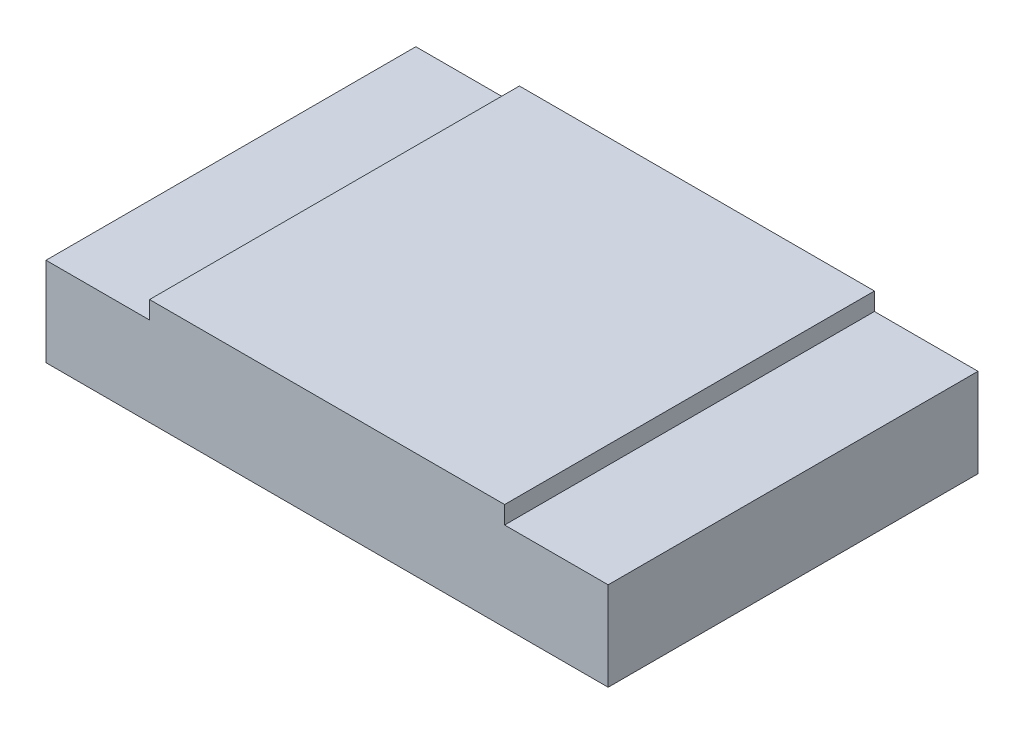
ISO-10303-21;
HEADER;
FILE_DESCRIPTION(('STEP AP214'),'2;1');
FILE_NAME('part.step','',(''),(''),'','','');
FILE_SCHEMA(('AUTOMOTIVE_DESIGN { 1 0 10303 214 1 1 1 1 }'));
ENDSEC;
DATA;
#1=APPLICATION_CONTEXT('core data for automotive mechanical design processes');
#2=APPLICATION_PROTOCOL_DEFINITION('international standard','automotive_design',2000,#1);
#3=PRODUCT_CONTEXT('',#1,'mechanical');
#4=PRODUCT('Part','Part','',(#3));
#5=PRODUCT_RELATED_PRODUCT_CATEGORY('part','',(#4));
#6=PRODUCT_DEFINITION_FORMATION('','',#4);
#7=PRODUCT_DEFINITION_CONTEXT('part definition',#1,'design');
#8=PRODUCT_DEFINITION('design','',#6,#7);
#9=PRODUCT_DEFINITION_SHAPE('','',#8);
#10=(LENGTH_UNIT() NAMED_UNIT(*) SI_UNIT(.MILLI.,.METRE.));
#11=(NAMED_UNIT(*) PLANE_ANGLE_UNIT() SI_UNIT($,.RADIAN.));
#12=(NAMED_UNIT(*) SI_UNIT($,.STERADIAN.) SOLID_ANGLE_UNIT());
#13=UNCERTAINTY_MEASURE_WITH_UNIT(LENGTH_MEASURE(1.E-05),#10,'distance_accuracy_value','');
#14=(GEOMETRIC_REPRESENTATION_CONTEXT(3) GLOBAL_UNCERTAINTY_ASSIGNED_CONTEXT((#13)) GLOBAL_UNIT_ASSIGNED_CONTEXT((#10,
#11,#12)) REPRESENTATION_CONTEXT('',''));
#15=CARTESIAN_POINT('',(0.,0.,0.));
#16=DIRECTION('',(0.,0.,1.));
#17=DIRECTION('',(1.,0.,0.));
#18=AXIS2_PLACEMENT_3D('',#15,#16,#17);
#19=CARTESIAN_POINT('',(0.775,0.15,-0.625));
#20=DIRECTION('',(0.,1.,0.));
#21=DIRECTION('',(-1.,0.,0.));
#22=AXIS2_PLACEMENT_3D('',#19,#20,#21);
#23=PLANE('',#22);
#24=DIRECTION('',(1.,0.,0.));
#25=VECTOR('',#24,1.);
#26=CARTESIAN_POINT('',(0.,0.15,0.625));
#27=LINE('',#26,#25);
#28=CARTESIAN_POINT('',(0.95,0.15,0.625));
#29=VERTEX_POINT('',#28);
#30=CARTESIAN_POINT('',(0.6,0.15,0.625));
#31=VERTEX_POINT('',#30);
#32=EDGE_CURVE('E130',#29,#31,#27,.F.);
#33=ORIENTED_EDGE('',*,*,#32,.F.);
#34=DIRECTION('',(0.,0.,1.));
#35=VECTOR('',#34,1.);
#36=CARTESIAN_POINT('',(0.95,0.15,-0.625));
#37=LINE('',#36,#35);
#38=CARTESIAN_POINT('',(0.95,0.15,-0.625));
#39=VERTEX_POINT('',#38);
#40=EDGE_CURVE('E123',#39,#29,#37,.T.);
#41=ORIENTED_EDGE('',*,*,#40,.F.);
#42=DIRECTION('',(1.,0.,0.));
#43=VECTOR('',#42,1.);
#44=CARTESIAN_POINT('',(0.,0.15,-0.625));
#45=LINE('',#44,#43);
#46=CARTESIAN_POINT('',(0.6,0.15,-0.625));
#47=VERTEX_POINT('',#46);
#48=EDGE_CURVE('E105',#39,#47,#45,.F.);
#49=ORIENTED_EDGE('',*,*,#48,.T.);
#50=DIRECTION('',(0.,0.,1.));
#51=VECTOR('',#50,1.);
#52=CARTESIAN_POINT('',(0.6,0.15,-0.625));
#53=LINE('',#52,#51);
#54=EDGE_CURVE('E20',#31,#47,#53,.F.);
#55=ORIENTED_EDGE('',*,*,#54,.F.);
#56=EDGE_LOOP('',(#33,#41,#49,#55));
#57=FACE_BOUND('',#56,.T.);
#58=ADVANCED_FACE('F17',(#57),#23,.T.);
#59=CARTESIAN_POINT('',(0.6,0.18,-0.625));
#60=DIRECTION('',(1.,0.,0.));
#61=DIRECTION('',(0.,1.,0.));
#62=AXIS2_PLACEMENT_3D('',#59,#60,#61);
#63=PLANE('',#62);
#64=DIRECTION('',(0.,1.,0.));
#65=VECTOR('',#64,1.);
#66=CARTESIAN_POINT('',(0.6,0.02070796460177,0.625));
#67=LINE('',#66,#65);
#68=CARTESIAN_POINT('',(0.6,0.21,0.625));
#69=VERTEX_POINT('',#68);
#70=EDGE_CURVE('E115',#31,#69,#67,.T.);
#71=ORIENTED_EDGE('',*,*,#70,.F.);
#72=ORIENTED_EDGE('',*,*,#54,.T.);
#73=DIRECTION('',(0.,1.,0.));
#74=VECTOR('',#73,1.);
#75=CARTESIAN_POINT('',(0.6,0.02070796460177,-0.625));
#76=LINE('',#75,#74);
#77=CARTESIAN_POINT('',(0.6,0.21,-0.625));
#78=VERTEX_POINT('',#77);
#79=EDGE_CURVE('E113',#47,#78,#76,.T.);
#80=ORIENTED_EDGE('',*,*,#79,.T.);
#81=DIRECTION('',(0.,0.,1.));
#82=VECTOR('',#81,1.);
#83=CARTESIAN_POINT('',(0.6,0.21,-0.625));
#84=LINE('',#83,#82);
#85=EDGE_CURVE('E79',#69,#78,#84,.F.);
#86=ORIENTED_EDGE('',*,*,#85,.F.);
#87=EDGE_LOOP('',(#71,#72,#80,#86));
#88=FACE_BOUND('',#87,.T.);
#89=ADVANCED_FACE('F112',(#88),#63,.T.);
#90=CARTESIAN_POINT('',(0.,0.21,-0.625));
#91=DIRECTION('',(0.,1.,0.));
#92=DIRECTION('',(-1.,0.,0.));
#93=AXIS2_PLACEMENT_3D('',#90,#91,#92);
#94=PLANE('',#93);
#95=DIRECTION('',(1.,0.,0.));
#96=VECTOR('',#95,1.);
#97=CARTESIAN_POINT('',(0.,0.21,0.625));
#98=LINE('',#97,#96);
#99=CARTESIAN_POINT('',(-0.6,0.21,0.625));
#100=VERTEX_POINT('',#99);
#101=EDGE_CURVE('E133',#69,#100,#98,.F.);
#102=ORIENTED_EDGE('',*,*,#101,.F.);
#103=ORIENTED_EDGE('',*,*,#85,.T.);
#104=DIRECTION('',(1.,0.,0.));
#105=VECTOR('',#104,1.);
#106=CARTESIAN_POINT('',(0.,0.21,-0.625));
#107=LINE('',#106,#105);
#108=CARTESIAN_POINT('',(-0.6,0.21,-0.625));
#109=VERTEX_POINT('',#108);
#110=EDGE_CURVE('E82',#78,#109,#107,.F.);
#111=ORIENTED_EDGE('',*,*,#110,.T.);
#112=DIRECTION('',(0.,0.,1.));
#113=VECTOR('',#112,1.);
#114=CARTESIAN_POINT('',(-0.6,0.21,-0.625));
#115=LINE('',#114,#113);
#116=EDGE_CURVE('E85',#100,#109,#115,.F.);
#117=ORIENTED_EDGE('',*,*,#116,.F.);
#118=EDGE_LOOP('',(#102,#103,#111,#117));
#119=FACE_BOUND('',#118,.T.);
#120=ADVANCED_FACE('F84',(#119),#94,.T.);
#121=CARTESIAN_POINT('',(-0.6,0.18,-0.625));
#122=DIRECTION('',(-1.,0.,0.));
#123=DIRECTION('',(0.,-1.,0.));
#124=AXIS2_PLACEMENT_3D('',#121,#122,#123);
#125=PLANE('',#124);
#126=DIRECTION('',(0.,1.,0.));
#127=VECTOR('',#126,1.);
#128=CARTESIAN_POINT('',(-0.6,0.02070796460177,0.625));
#129=LINE('',#128,#127);
#130=CARTESIAN_POINT('',(-0.6,0.15,0.625));
#131=VERTEX_POINT('',#130);
#132=EDGE_CURVE('E97',#100,#131,#129,.F.);
#133=ORIENTED_EDGE('',*,*,#132,.F.);
#134=ORIENTED_EDGE('',*,*,#116,.T.);
#135=DIRECTION('',(0.,1.,0.));
#136=VECTOR('',#135,1.);
#137=CARTESIAN_POINT('',(-0.6,0.02070796460177,-0.625));
#138=LINE('',#137,#136);
#139=CARTESIAN_POINT('',(-0.6,0.15,-0.625));
#140=VERTEX_POINT('',#139);
#141=EDGE_CURVE('E90',#109,#140,#138,.F.);
#142=ORIENTED_EDGE('',*,*,#141,.T.);
#143=DIRECTION('',(0.,0.,1.));
#144=VECTOR('',#143,1.);
#145=CARTESIAN_POINT('',(-0.6,0.15,-0.625));
#146=LINE('',#145,#144);
#147=EDGE_CURVE('E91',#131,#140,#146,.F.);
#148=ORIENTED_EDGE('',*,*,#147,.F.);
#149=EDGE_LOOP('',(#133,#134,#142,#148));
#150=FACE_BOUND('',#149,.T.);
#151=ADVANCED_FACE('F94',(#150),#125,.T.);
#152=CARTESIAN_POINT('',(-0.775,0.15,-0.625));
#153=DIRECTION('',(0.,1.,0.));
#154=DIRECTION('',(-1.,0.,0.));
#155=AXIS2_PLACEMENT_3D('',#152,#153,#154);
#156=PLANE('',#155);
#157=DIRECTION('',(1.,0.,0.));
#158=VECTOR('',#157,1.);
#159=CARTESIAN_POINT('',(0.,0.15,0.625));
#160=LINE('',#159,#158);
#161=CARTESIAN_POINT('',(-0.95,0.15,0.625));
#162=VERTEX_POINT('',#161);
#163=EDGE_CURVE('E136',#131,#162,#160,.F.);
#164=ORIENTED_EDGE('',*,*,#163,.F.);
#165=ORIENTED_EDGE('',*,*,#147,.T.);
#166=DIRECTION('',(1.,0.,0.));
#167=VECTOR('',#166,1.);
#168=CARTESIAN_POINT('',(0.,0.15,-0.625));
#169=LINE('',#168,#167);
#170=CARTESIAN_POINT('',(-0.95,0.15,-0.625));
#171=VERTEX_POINT('',#170);
#172=EDGE_CURVE('E103',#140,#171,#169,.F.);
#173=ORIENTED_EDGE('',*,*,#172,.T.);
#174=DIRECTION('',(0.,0.,1.));
#175=VECTOR('',#174,1.);
#176=CARTESIAN_POINT('',(-0.95,0.15,-0.625));
#177=LINE('',#176,#175);
#178=EDGE_CURVE('E142',#162,#171,#177,.F.);
#179=ORIENTED_EDGE('',*,*,#178,.F.);
#180=EDGE_LOOP('',(#164,#165,#173,#179));
#181=FACE_BOUND('',#180,.T.);
#182=ADVANCED_FACE('F178',(#181),#156,.T.);
#183=CARTESIAN_POINT('',(0.,0.02070796460177,-0.625));
#184=DIRECTION('',(0.,0.,1.));
#185=DIRECTION('',(1.,0.,0.));
#186=AXIS2_PLACEMENT_3D('',#183,#184,#185);
#187=PLANE('',#186);
#188=ORIENTED_EDGE('',*,*,#48,.F.);
#189=DIRECTION('',(0.,1.,0.));
#190=VECTOR('',#189,1.);
#191=CARTESIAN_POINT('',(0.95,0.,-0.625));
#192=LINE('',#191,#190);
#193=CARTESIAN_POINT('',(0.95,-0.15,-0.625));
#194=VERTEX_POINT('',#193);
#195=EDGE_CURVE('E120',#194,#39,#192,.T.);
#196=ORIENTED_EDGE('',*,*,#195,.F.);
#197=DIRECTION('',(1.,0.,0.));
#198=VECTOR('',#197,1.);
#199=CARTESIAN_POINT('',(0.,-0.15,-0.625));
#200=LINE('',#199,#198);
#201=CARTESIAN_POINT('',(-0.95,-0.15,-0.625));
#202=VERTEX_POINT('',#201);
#203=EDGE_CURVE('E145',#202,#194,#200,.T.);
#204=ORIENTED_EDGE('',*,*,#203,.F.);
#205=DIRECTION('',(0.,-1.,0.));
#206=VECTOR('',#205,1.);
#207=CARTESIAN_POINT('',(-0.95,0.,-0.625));
#208=LINE('',#207,#206);
#209=EDGE_CURVE('E138',#171,#202,#208,.T.);
#210=ORIENTED_EDGE('',*,*,#209,.F.);
#211=ORIENTED_EDGE('',*,*,#172,.F.);
#212=ORIENTED_EDGE('',*,*,#141,.F.);
#213=ORIENTED_EDGE('',*,*,#110,.F.);
#214=ORIENTED_EDGE('',*,*,#79,.F.);
#215=EDGE_LOOP('',(#188,#196,#204,#210,#211,#212,#213,#214));
#216=FACE_BOUND('',#215,.T.);
#217=ADVANCED_FACE('F101',(#216),#187,.F.);
#218=CARTESIAN_POINT('',(0.95,0.,-0.625));
#219=DIRECTION('',(1.,0.,0.));
#220=DIRECTION('',(0.,1.,0.));
#221=AXIS2_PLACEMENT_3D('',#218,#219,#220);
#222=PLANE('',#221);
#223=DIRECTION('',(0.,1.,0.));
#224=VECTOR('',#223,1.);
#225=CARTESIAN_POINT('',(0.95,0.02070796460177,0.625));
#226=LINE('',#225,#224);
#227=CARTESIAN_POINT('',(0.95,-0.15,0.625));
#228=VERTEX_POINT('',#227);
#229=EDGE_CURVE('E127',#228,#29,#226,.T.);
#230=ORIENTED_EDGE('',*,*,#229,.F.);
#231=DIRECTION('',(0.,0.,1.));
#232=VECTOR('',#231,1.);
#233=CARTESIAN_POINT('',(0.95,-0.15,-0.625));
#234=LINE('',#233,#232);
#235=EDGE_CURVE('E148',#194,#228,#234,.T.);
#236=ORIENTED_EDGE('',*,*,#235,.F.);
#237=ORIENTED_EDGE('',*,*,#195,.T.);
#238=ORIENTED_EDGE('',*,*,#40,.T.);
#239=EDGE_LOOP('',(#230,#236,#237,#238));
#240=FACE_BOUND('',#239,.T.);
#241=ADVANCED_FACE('F157',(#240),#222,.T.);
#242=CARTESIAN_POINT('',(0.,0.02070796460177,0.625));
#243=DIRECTION('',(0.,0.,1.));
#244=DIRECTION('',(1.,0.,0.));
#245=AXIS2_PLACEMENT_3D('',#242,#243,#244);
#246=PLANE('',#245);
#247=DIRECTION('',(0.,-1.,0.));
#248=VECTOR('',#247,1.);
#249=CARTESIAN_POINT('',(-0.95,0.,0.625));
#250=LINE('',#249,#248);
#251=CARTESIAN_POINT('',(-0.95,-0.15,0.625));
#252=VERTEX_POINT('',#251);
#253=EDGE_CURVE('E35',#252,#162,#250,.F.);
#254=ORIENTED_EDGE('',*,*,#253,.F.);
#255=DIRECTION('',(1.,0.,0.));
#256=VECTOR('',#255,1.);
#257=CARTESIAN_POINT('',(0.,-0.15,0.625));
#258=LINE('',#257,#256);
#259=EDGE_CURVE('E26',#228,#252,#258,.F.);
#260=ORIENTED_EDGE('',*,*,#259,.F.);
#261=ORIENTED_EDGE('',*,*,#229,.T.);
#262=ORIENTED_EDGE('',*,*,#32,.T.);
#263=ORIENTED_EDGE('',*,*,#70,.T.);
#264=ORIENTED_EDGE('',*,*,#101,.T.);
#265=ORIENTED_EDGE('',*,*,#132,.T.);
#266=ORIENTED_EDGE('',*,*,#163,.T.);
#267=EDGE_LOOP('',(#254,#260,#261,#262,#263,#264,#265,#266));
#268=FACE_BOUND('',#267,.T.);
#269=ADVANCED_FACE('F155',(#268),#246,.T.);
#270=CARTESIAN_POINT('',(-0.95,0.,-0.625));
#271=DIRECTION('',(-1.,0.,0.));
#272=DIRECTION('',(0.,-1.,0.));
#273=AXIS2_PLACEMENT_3D('',#270,#271,#272);
#274=PLANE('',#273);
#275=ORIENTED_EDGE('',*,*,#253,.T.);
#276=ORIENTED_EDGE('',*,*,#178,.T.);
#277=ORIENTED_EDGE('',*,*,#209,.T.);
#278=DIRECTION('',(0.,0.,1.));
#279=VECTOR('',#278,1.);
#280=CARTESIAN_POINT('',(-0.95,-0.15,-0.625));
#281=LINE('',#280,#279);
#282=EDGE_CURVE('E11',#252,#202,#281,.F.);
#283=ORIENTED_EDGE('',*,*,#282,.F.);
#284=EDGE_LOOP('',(#275,#276,#277,#283));
#285=FACE_BOUND('',#284,.T.);
#286=ADVANCED_FACE('F164',(#285),#274,.T.);
#287=CARTESIAN_POINT('',(0.,-0.15,-0.625));
#288=DIRECTION('',(0.,-1.,0.));
#289=DIRECTION('',(1.,0.,0.));
#290=AXIS2_PLACEMENT_3D('',#287,#288,#289);
#291=PLANE('',#290);
#292=ORIENTED_EDGE('',*,*,#259,.T.);
#293=ORIENTED_EDGE('',*,*,#282,.T.);
#294=ORIENTED_EDGE('',*,*,#203,.T.);
#295=ORIENTED_EDGE('',*,*,#235,.T.);
#296=EDGE_LOOP('',(#292,#293,#294,#295));
#297=FACE_BOUND('',#296,.T.);
#298=ADVANCED_FACE('F153',(#297),#291,.T.);
#299=CLOSED_SHELL('',(#58,#89,#120,#151,#182,#217,#241,#269,#286,#298));
#300=MANIFOLD_SOLID_BREP('B1',#299);
#301=ADVANCED_BREP_SHAPE_REPRESENTATION('',(#18,#300),#14);
#302=SHAPE_DEFINITION_REPRESENTATION(#9,#301);
ENDSEC;
END-ISO-10303-21;
